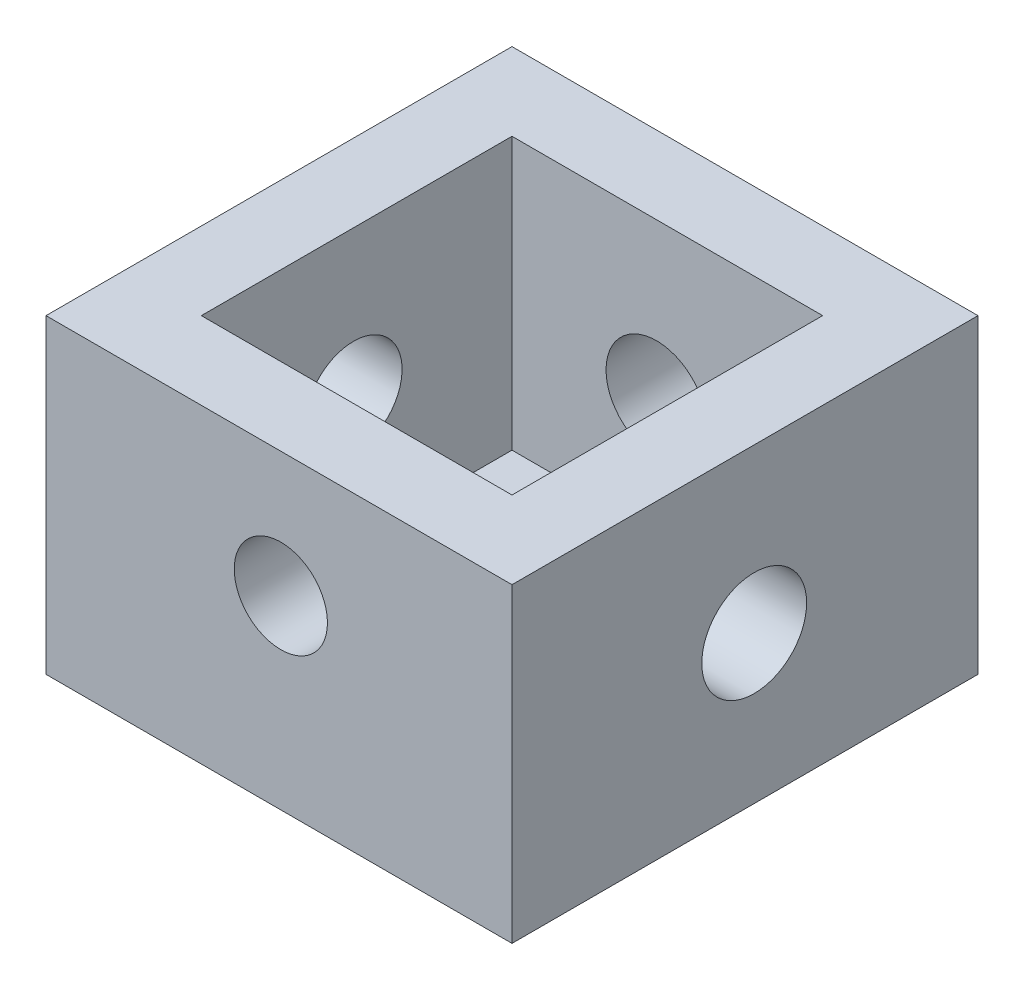
ISO-10303-21;
HEADER;
FILE_DESCRIPTION(('STEP AP214'),'2;1');
FILE_NAME('part.step','',(''),(''),'','','');
FILE_SCHEMA(('AUTOMOTIVE_DESIGN { 1 0 10303 214 1 1 1 1 }'));
ENDSEC;
DATA;
#1=APPLICATION_CONTEXT('core data for automotive mechanical design processes');
#2=APPLICATION_PROTOCOL_DEFINITION('international standard','automotive_design',2000,#1);
#3=PRODUCT_CONTEXT('',#1,'mechanical');
#4=PRODUCT('Part','Part','',(#3));
#5=PRODUCT_RELATED_PRODUCT_CATEGORY('part','',(#4));
#6=PRODUCT_DEFINITION_FORMATION('','',#4);
#7=PRODUCT_DEFINITION_CONTEXT('part definition',#1,'design');
#8=PRODUCT_DEFINITION('design','',#6,#7);
#9=PRODUCT_DEFINITION_SHAPE('','',#8);
#10=(LENGTH_UNIT() NAMED_UNIT(*) SI_UNIT(.MILLI.,.METRE.));
#11=(NAMED_UNIT(*) PLANE_ANGLE_UNIT() SI_UNIT($,.RADIAN.));
#12=(NAMED_UNIT(*) SI_UNIT($,.STERADIAN.) SOLID_ANGLE_UNIT());
#13=UNCERTAINTY_MEASURE_WITH_UNIT(LENGTH_MEASURE(1.E-05),#10,'distance_accuracy_value','');
#14=(GEOMETRIC_REPRESENTATION_CONTEXT(3) GLOBAL_UNCERTAINTY_ASSIGNED_CONTEXT((#13)) GLOBAL_UNIT_ASSIGNED_CONTEXT((#10,
#11,#12)) REPRESENTATION_CONTEXT('',''));
#15=CARTESIAN_POINT('',(0.,0.,0.));
#16=DIRECTION('',(0.,0.,1.));
#17=DIRECTION('',(1.,0.,0.));
#18=AXIS2_PLACEMENT_3D('',#15,#16,#17);
#19=CARTESIAN_POINT('',(-47.6315789473684,40.,-77.2368421052632));
#20=DIRECTION('',(1.,0.,0.));
#21=DIRECTION('',(0.,0.,-1.));
#22=AXIS2_PLACEMENT_3D('',#19,#20,#21);
#23=PLANE('',#22);
#24=DIRECTION('',(0.,0.,1.));
#25=VECTOR('',#24,1.);
#26=CARTESIAN_POINT('',(-47.6315789473684,0.,-77.2368421052632));
#27=LINE('',#26,#25);
#28=CARTESIAN_POINT('',(-47.6315789473684,0.,-77.2368421052632));
#29=VERTEX_POINT('',#28);
#30=CARTESIAN_POINT('',(-47.6315789473684,0.,-17.2368421052632));
#31=VERTEX_POINT('',#30);
#32=EDGE_CURVE('E160',#29,#31,#27,.T.);
#33=ORIENTED_EDGE('',*,*,#32,.T.);
#34=DIRECTION('',(0.,-1.,0.));
#35=VECTOR('',#34,1.);
#36=CARTESIAN_POINT('',(-47.6315789473684,40.,-17.2368421052632));
#37=LINE('',#36,#35);
#38=CARTESIAN_POINT('',(-47.6315789473684,40.,-17.2368421052632));
#39=VERTEX_POINT('',#38);
#40=EDGE_CURVE('E164',#39,#31,#37,.T.);
#41=ORIENTED_EDGE('',*,*,#40,.F.);
#42=DIRECTION('',(0.,0.,1.));
#43=VECTOR('',#42,1.);
#44=CARTESIAN_POINT('',(-47.6315789473684,40.,-77.2368421052632));
#45=LINE('',#44,#43);
#46=CARTESIAN_POINT('',(-47.6315789473684,40.,-77.2368421052632));
#47=VERTEX_POINT('',#46);
#48=EDGE_CURVE('E152',#47,#39,#45,.T.);
#49=ORIENTED_EDGE('',*,*,#48,.F.);
#50=DIRECTION('',(0.,-1.,0.));
#51=VECTOR('',#50,1.);
#52=CARTESIAN_POINT('',(-47.6315789473684,40.,-77.2368421052632));
#53=LINE('',#52,#51);
#54=EDGE_CURVE('E41',#47,#29,#53,.T.);
#55=ORIENTED_EDGE('',*,*,#54,.T.);
#56=EDGE_LOOP('',(#33,#41,#49,#55));
#57=FACE_BOUND('',#56,.T.);
#58=CARTESIAN_POINT('',(-47.6315789473684,21.0932716684626,-46.8351131772574));
#59=DIRECTION('',(-1.,0.,0.));
#60=DIRECTION('',(0.,0.,1.));
#61=AXIS2_PLACEMENT_3D('',#58,#59,#60);
#62=CIRCLE('',#61,6.25);
#63=CARTESIAN_POINT('',(-47.6315789473684,21.0932716684626,-40.5851131772574));
#64=VERTEX_POINT('',#63);
#65=EDGE_CURVE('E196',#64,#64,#62,.T.);
#66=ORIENTED_EDGE('',*,*,#65,.F.);
#67=EDGE_LOOP('',(#66));
#68=FACE_BOUND('',#67,.T.);
#69=ADVANCED_FACE('F33',(#57,#68),#23,.F.);
#70=CARTESIAN_POINT('',(-47.6315789473684,40.,-17.2368421052632));
#71=DIRECTION('',(0.,0.,-1.));
#72=DIRECTION('',(-1.,0.,0.));
#73=AXIS2_PLACEMENT_3D('',#70,#71,#72);
#74=PLANE('',#73);
#75=DIRECTION('',(1.,0.,0.));
#76=VECTOR('',#75,1.);
#77=CARTESIAN_POINT('',(-47.6315789473684,0.,-17.2368421052632));
#78=LINE('',#77,#76);
#79=CARTESIAN_POINT('',(12.3684210526316,0.,-17.2368421052632));
#80=VERTEX_POINT('',#79);
#81=EDGE_CURVE('E78',#31,#80,#78,.T.);
#82=ORIENTED_EDGE('',*,*,#81,.T.);
#83=DIRECTION('',(0.,-1.,0.));
#84=VECTOR('',#83,1.);
#85=CARTESIAN_POINT('',(12.3684210526316,40.,-17.2368421052632));
#86=LINE('',#85,#84);
#87=CARTESIAN_POINT('',(12.3684210526316,40.,-17.2368421052632));
#88=VERTEX_POINT('',#87);
#89=EDGE_CURVE('E155',#88,#80,#86,.T.);
#90=ORIENTED_EDGE('',*,*,#89,.F.);
#91=DIRECTION('',(1.,0.,0.));
#92=VECTOR('',#91,1.);
#93=CARTESIAN_POINT('',(-47.6315789473684,40.,-17.2368421052632));
#94=LINE('',#93,#92);
#95=EDGE_CURVE('E57',#39,#88,#94,.T.);
#96=ORIENTED_EDGE('',*,*,#95,.F.);
#97=ORIENTED_EDGE('',*,*,#40,.T.);
#98=EDGE_LOOP('',(#82,#90,#96,#97));
#99=FACE_BOUND('',#98,.T.);
#100=CARTESIAN_POINT('',(-17.3938566500453,23.8673899247033,-17.2368421052632));
#101=DIRECTION('',(0.,0.,1.));
#102=DIRECTION('',(1.,0.,0.));
#103=AXIS2_PLACEMENT_3D('',#100,#101,#102);
#104=CIRCLE('',#103,6.);
#105=CARTESIAN_POINT('',(-11.3938566500453,23.8673899247033,-17.2368421052632));
#106=VERTEX_POINT('',#105);
#107=EDGE_CURVE('E183',#106,#106,#104,.T.);
#108=ORIENTED_EDGE('',*,*,#107,.F.);
#109=EDGE_LOOP('',(#108));
#110=FACE_BOUND('',#109,.T.);
#111=ADVANCED_FACE('F177',(#99,#110),#74,.F.);
#112=CARTESIAN_POINT('',(12.3684210526316,40.,-77.2368421052632));
#113=DIRECTION('',(-1.,0.,0.));
#114=DIRECTION('',(0.,0.,1.));
#115=AXIS2_PLACEMENT_3D('',#112,#113,#114);
#116=PLANE('',#115);
#117=CARTESIAN_POINT('',(12.3684210526316,19.0144091342364,-48.4215666866429));
#118=DIRECTION('',(1.,0.,0.));
#119=DIRECTION('',(0.,0.,-1.));
#120=AXIS2_PLACEMENT_3D('',#117,#118,#119);
#121=CIRCLE('',#120,6.75);
#122=CARTESIAN_POINT('',(12.3684210526316,19.0144091342364,-55.1715666866429));
#123=VERTEX_POINT('',#122);
#124=EDGE_CURVE('E188',#123,#123,#121,.T.);
#125=ORIENTED_EDGE('',*,*,#124,.F.);
#126=EDGE_LOOP('',(#125));
#127=FACE_BOUND('',#126,.T.);
#128=DIRECTION('',(0.,0.,-1.));
#129=VECTOR('',#128,1.);
#130=CARTESIAN_POINT('',(12.3684210526316,0.,-77.2368421052632));
#131=LINE('',#130,#129);
#132=CARTESIAN_POINT('',(12.3684210526316,0.,-77.2368421052632));
#133=VERTEX_POINT('',#132);
#134=EDGE_CURVE('E145',#80,#133,#131,.T.);
#135=ORIENTED_EDGE('',*,*,#134,.T.);
#136=DIRECTION('',(0.,-1.,0.));
#137=VECTOR('',#136,1.);
#138=CARTESIAN_POINT('',(12.3684210526316,40.,-77.2368421052632));
#139=LINE('',#138,#137);
#140=CARTESIAN_POINT('',(12.3684210526316,40.,-77.2368421052632));
#141=VERTEX_POINT('',#140);
#142=EDGE_CURVE('E11',#141,#133,#139,.T.);
#143=ORIENTED_EDGE('',*,*,#142,.F.);
#144=DIRECTION('',(0.,0.,-1.));
#145=VECTOR('',#144,1.);
#146=CARTESIAN_POINT('',(12.3684210526316,40.,-77.2368421052632));
#147=LINE('',#146,#145);
#148=EDGE_CURVE('E149',#88,#141,#147,.T.);
#149=ORIENTED_EDGE('',*,*,#148,.F.);
#150=ORIENTED_EDGE('',*,*,#89,.T.);
#151=EDGE_LOOP('',(#135,#143,#149,#150));
#152=FACE_BOUND('',#151,.T.);
#153=ADVANCED_FACE('F35',(#127,#152),#116,.F.);
#154=CARTESIAN_POINT('',(-47.6315789473684,40.,-77.2368421052632));
#155=DIRECTION('',(0.,0.,1.));
#156=DIRECTION('',(1.,0.,0.));
#157=AXIS2_PLACEMENT_3D('',#154,#155,#156);
#158=PLANE('',#157);
#159=CARTESIAN_POINT('',(-19.022665383632,20.0118224268138,-77.2368421052632));
#160=DIRECTION('',(0.,0.,-1.));
#161=DIRECTION('',(-1.,0.,0.));
#162=AXIS2_PLACEMENT_3D('',#159,#160,#161);
#163=CIRCLE('',#162,6.5);
#164=CARTESIAN_POINT('',(-25.522665383632,20.0118224268138,-77.2368421052632));
#165=VERTEX_POINT('',#164);
#166=EDGE_CURVE('E202',#165,#165,#163,.T.);
#167=ORIENTED_EDGE('',*,*,#166,.F.);
#168=EDGE_LOOP('',(#167));
#169=FACE_BOUND('',#168,.T.);
#170=DIRECTION('',(-1.,0.,0.));
#171=VECTOR('',#170,1.);
#172=CARTESIAN_POINT('',(-47.6315789473684,0.,-77.2368421052632));
#173=LINE('',#172,#171);
#174=EDGE_CURVE('E158',#133,#29,#173,.T.);
#175=ORIENTED_EDGE('',*,*,#174,.T.);
#176=ORIENTED_EDGE('',*,*,#54,.F.);
#177=DIRECTION('',(-1.,0.,0.));
#178=VECTOR('',#177,1.);
#179=CARTESIAN_POINT('',(-47.6315789473684,40.,-77.2368421052632));
#180=LINE('',#179,#178);
#181=EDGE_CURVE('E85',#141,#47,#180,.T.);
#182=ORIENTED_EDGE('',*,*,#181,.F.);
#183=ORIENTED_EDGE('',*,*,#142,.T.);
#184=EDGE_LOOP('',(#175,#176,#182,#183));
#185=FACE_BOUND('',#184,.T.);
#186=ADVANCED_FACE('F208',(#169,#185),#158,.F.);
#187=CARTESIAN_POINT('',(0.,40.,0.));
#188=DIRECTION('',(0.,1.,0.));
#189=DIRECTION('',(0.,0.,1.));
#190=AXIS2_PLACEMENT_3D('',#187,#188,#189);
#191=PLANE('',#190);
#192=DIRECTION('',(0.,0.,-1.));
#193=VECTOR('',#192,1.);
#194=CARTESIAN_POINT('',(2.36842105263158,40.,-67.2368421052632));
#195=LINE('',#194,#193);
#196=CARTESIAN_POINT('',(2.36842105263158,40.,-27.2368421052632));
#197=VERTEX_POINT('',#196);
#198=CARTESIAN_POINT('',(2.36842105263158,40.,-67.2368421052632));
#199=VERTEX_POINT('',#198);
#200=EDGE_CURVE('E48',#197,#199,#195,.T.);
#201=ORIENTED_EDGE('',*,*,#200,.F.);
#202=DIRECTION('',(1.,0.,0.));
#203=VECTOR('',#202,1.);
#204=CARTESIAN_POINT('',(-37.6315789473684,40.,-27.2368421052632));
#205=LINE('',#204,#203);
#206=CARTESIAN_POINT('',(-37.6315789473684,40.,-27.2368421052632));
#207=VERTEX_POINT('',#206);
#208=EDGE_CURVE('E127',#207,#197,#205,.T.);
#209=ORIENTED_EDGE('',*,*,#208,.F.);
#210=DIRECTION('',(0.,0.,1.));
#211=VECTOR('',#210,1.);
#212=CARTESIAN_POINT('',(-37.6315789473684,40.,-67.2368421052632));
#213=LINE('',#212,#211);
#214=CARTESIAN_POINT('',(-37.6315789473684,40.,-67.2368421052632));
#215=VERTEX_POINT('',#214);
#216=EDGE_CURVE('E130',#215,#207,#213,.T.);
#217=ORIENTED_EDGE('',*,*,#216,.F.);
#218=DIRECTION('',(-1.,0.,0.));
#219=VECTOR('',#218,1.);
#220=CARTESIAN_POINT('',(-37.6315789473684,40.,-67.2368421052632));
#221=LINE('',#220,#219);
#222=EDGE_CURVE('E139',#199,#215,#221,.T.);
#223=ORIENTED_EDGE('',*,*,#222,.F.);
#224=EDGE_LOOP('',(#201,#209,#217,#223));
#225=FACE_BOUND('',#224,.T.);
#226=ORIENTED_EDGE('',*,*,#148,.T.);
#227=ORIENTED_EDGE('',*,*,#181,.T.);
#228=ORIENTED_EDGE('',*,*,#48,.T.);
#229=ORIENTED_EDGE('',*,*,#95,.T.);
#230=EDGE_LOOP('',(#226,#227,#228,#229));
#231=FACE_BOUND('',#230,.T.);
#232=ADVANCED_FACE('F210',(#225,#231),#191,.T.);
#233=CARTESIAN_POINT('',(0.,0.,0.));
#234=DIRECTION('',(0.,1.,0.));
#235=DIRECTION('',(0.,0.,1.));
#236=AXIS2_PLACEMENT_3D('',#233,#234,#235);
#237=PLANE('',#236);
#238=ORIENTED_EDGE('',*,*,#134,.F.);
#239=ORIENTED_EDGE('',*,*,#81,.F.);
#240=ORIENTED_EDGE('',*,*,#32,.F.);
#241=ORIENTED_EDGE('',*,*,#174,.F.);
#242=EDGE_LOOP('',(#238,#239,#240,#241));
#243=FACE_BOUND('',#242,.T.);
#244=ADVANCED_FACE('F173',(#243),#237,.F.);
#245=CARTESIAN_POINT('',(2.36842105263158,5.,-67.2368421052632));
#246=DIRECTION('',(1.,0.,0.));
#247=DIRECTION('',(0.,0.,-1.));
#248=AXIS2_PLACEMENT_3D('',#245,#246,#247);
#249=PLANE('',#248);
#250=CARTESIAN_POINT('',(2.36842105263158,19.0144091342364,-48.4215666866429));
#251=DIRECTION('',(1.,0.,0.));
#252=DIRECTION('',(0.,0.,-1.));
#253=AXIS2_PLACEMENT_3D('',#250,#251,#252);
#254=CIRCLE('',#253,6.75);
#255=CARTESIAN_POINT('',(2.36842105263158,19.0144091342364,-55.1715666866429));
#256=VERTEX_POINT('',#255);
#257=EDGE_CURVE('E185',#256,#256,#254,.T.);
#258=ORIENTED_EDGE('',*,*,#257,.T.);
#259=EDGE_LOOP('',(#258));
#260=FACE_BOUND('',#259,.T.);
#261=ORIENTED_EDGE('',*,*,#200,.T.);
#262=DIRECTION('',(0.,1.,0.));
#263=VECTOR('',#262,1.);
#264=CARTESIAN_POINT('',(2.36842105263158,5.,-67.2368421052632));
#265=LINE('',#264,#263);
#266=CARTESIAN_POINT('',(2.36842105263158,5.,-67.2368421052632));
#267=VERTEX_POINT('',#266);
#268=EDGE_CURVE('E105',#267,#199,#265,.T.);
#269=ORIENTED_EDGE('',*,*,#268,.F.);
#270=DIRECTION('',(0.,0.,-1.));
#271=VECTOR('',#270,1.);
#272=CARTESIAN_POINT('',(2.36842105263158,5.,-67.2368421052632));
#273=LINE('',#272,#271);
#274=CARTESIAN_POINT('',(2.36842105263158,5.,-27.2368421052632));
#275=VERTEX_POINT('',#274);
#276=EDGE_CURVE('E109',#275,#267,#273,.T.);
#277=ORIENTED_EDGE('',*,*,#276,.F.);
#278=DIRECTION('',(0.,1.,0.));
#279=VECTOR('',#278,1.);
#280=CARTESIAN_POINT('',(2.36842105263158,5.,-27.2368421052632));
#281=LINE('',#280,#279);
#282=EDGE_CURVE('E143',#275,#197,#281,.T.);
#283=ORIENTED_EDGE('',*,*,#282,.T.);
#284=EDGE_LOOP('',(#261,#269,#277,#283));
#285=FACE_BOUND('',#284,.T.);
#286=ADVANCED_FACE('F107',(#260,#285),#249,.F.);
#287=CARTESIAN_POINT('',(-37.6315789473684,5.,-27.2368421052632));
#288=DIRECTION('',(0.,0.,1.));
#289=DIRECTION('',(1.,0.,0.));
#290=AXIS2_PLACEMENT_3D('',#287,#288,#289);
#291=PLANE('',#290);
#292=CARTESIAN_POINT('',(-17.3938566500453,23.8673899247033,-27.2368421052632));
#293=DIRECTION('',(0.,0.,1.));
#294=DIRECTION('',(1.,0.,0.));
#295=AXIS2_PLACEMENT_3D('',#292,#293,#294);
#296=CIRCLE('',#295,6.);
#297=CARTESIAN_POINT('',(-11.3938566500453,23.8673899247033,-27.2368421052632));
#298=VERTEX_POINT('',#297);
#299=EDGE_CURVE('E133',#298,#298,#296,.T.);
#300=ORIENTED_EDGE('',*,*,#299,.T.);
#301=EDGE_LOOP('',(#300));
#302=FACE_BOUND('',#301,.T.);
#303=ORIENTED_EDGE('',*,*,#208,.T.);
#304=ORIENTED_EDGE('',*,*,#282,.F.);
#305=DIRECTION('',(1.,0.,0.));
#306=VECTOR('',#305,1.);
#307=CARTESIAN_POINT('',(-37.6315789473684,5.,-27.2368421052632));
#308=LINE('',#307,#306);
#309=CARTESIAN_POINT('',(-37.6315789473684,5.,-27.2368421052632));
#310=VERTEX_POINT('',#309);
#311=EDGE_CURVE('E115',#310,#275,#308,.T.);
#312=ORIENTED_EDGE('',*,*,#311,.F.);
#313=DIRECTION('',(0.,1.,0.));
#314=VECTOR('',#313,1.);
#315=CARTESIAN_POINT('',(-37.6315789473684,5.,-27.2368421052632));
#316=LINE('',#315,#314);
#317=EDGE_CURVE('E146',#310,#207,#316,.T.);
#318=ORIENTED_EDGE('',*,*,#317,.T.);
#319=EDGE_LOOP('',(#303,#304,#312,#318));
#320=FACE_BOUND('',#319,.T.);
#321=ADVANCED_FACE('F227',(#302,#320),#291,.F.);
#322=CARTESIAN_POINT('',(-37.6315789473684,5.,-67.2368421052632));
#323=DIRECTION('',(-1.,0.,0.));
#324=DIRECTION('',(0.,0.,1.));
#325=AXIS2_PLACEMENT_3D('',#322,#323,#324);
#326=PLANE('',#325);
#327=CARTESIAN_POINT('',(-37.6315789473684,21.0932716684626,-46.8351131772574));
#328=DIRECTION('',(-1.,0.,0.));
#329=DIRECTION('',(0.,0.,1.));
#330=AXIS2_PLACEMENT_3D('',#327,#328,#329);
#331=CIRCLE('',#330,6.25);
#332=CARTESIAN_POINT('',(-37.6315789473684,21.0932716684626,-40.5851131772574));
#333=VERTEX_POINT('',#332);
#334=EDGE_CURVE('E193',#333,#333,#331,.T.);
#335=ORIENTED_EDGE('',*,*,#334,.T.);
#336=EDGE_LOOP('',(#335));
#337=FACE_BOUND('',#336,.T.);
#338=ORIENTED_EDGE('',*,*,#216,.T.);
#339=ORIENTED_EDGE('',*,*,#317,.F.);
#340=DIRECTION('',(0.,0.,1.));
#341=VECTOR('',#340,1.);
#342=CARTESIAN_POINT('',(-37.6315789473684,5.,-67.2368421052632));
#343=LINE('',#342,#341);
#344=CARTESIAN_POINT('',(-37.6315789473684,5.,-67.2368421052632));
#345=VERTEX_POINT('',#344);
#346=EDGE_CURVE('E123',#345,#310,#343,.T.);
#347=ORIENTED_EDGE('',*,*,#346,.F.);
#348=DIRECTION('',(0.,1.,0.));
#349=VECTOR('',#348,1.);
#350=CARTESIAN_POINT('',(-37.6315789473684,5.,-67.2368421052632));
#351=LINE('',#350,#349);
#352=EDGE_CURVE('E114',#345,#215,#351,.T.);
#353=ORIENTED_EDGE('',*,*,#352,.T.);
#354=EDGE_LOOP('',(#338,#339,#347,#353));
#355=FACE_BOUND('',#354,.T.);
#356=ADVANCED_FACE('F231',(#337,#355),#326,.F.);
#357=CARTESIAN_POINT('',(-37.6315789473684,5.,-67.2368421052632));
#358=DIRECTION('',(0.,0.,-1.));
#359=DIRECTION('',(-1.,0.,0.));
#360=AXIS2_PLACEMENT_3D('',#357,#358,#359);
#361=PLANE('',#360);
#362=CARTESIAN_POINT('',(-19.022665383632,20.0118224268138,-67.2368421052632));
#363=DIRECTION('',(0.,0.,-1.));
#364=DIRECTION('',(-1.,0.,0.));
#365=AXIS2_PLACEMENT_3D('',#362,#363,#364);
#366=CIRCLE('',#365,6.5);
#367=CARTESIAN_POINT('',(-25.522665383632,20.0118224268138,-67.2368421052632));
#368=VERTEX_POINT('',#367);
#369=EDGE_CURVE('E199',#368,#368,#366,.T.);
#370=ORIENTED_EDGE('',*,*,#369,.T.);
#371=EDGE_LOOP('',(#370));
#372=FACE_BOUND('',#371,.T.);
#373=ORIENTED_EDGE('',*,*,#222,.T.);
#374=ORIENTED_EDGE('',*,*,#352,.F.);
#375=DIRECTION('',(-1.,0.,0.));
#376=VECTOR('',#375,1.);
#377=CARTESIAN_POINT('',(-37.6315789473684,5.,-67.2368421052632));
#378=LINE('',#377,#376);
#379=EDGE_CURVE('E118',#267,#345,#378,.T.);
#380=ORIENTED_EDGE('',*,*,#379,.F.);
#381=ORIENTED_EDGE('',*,*,#268,.T.);
#382=EDGE_LOOP('',(#373,#374,#380,#381));
#383=FACE_BOUND('',#382,.T.);
#384=ADVANCED_FACE('F119',(#372,#383),#361,.F.);
#385=CARTESIAN_POINT('',(0.,5.,0.));
#386=DIRECTION('',(0.,1.,0.));
#387=DIRECTION('',(0.,0.,1.));
#388=AXIS2_PLACEMENT_3D('',#385,#386,#387);
#389=PLANE('',#388);
#390=ORIENTED_EDGE('',*,*,#276,.T.);
#391=ORIENTED_EDGE('',*,*,#379,.T.);
#392=ORIENTED_EDGE('',*,*,#346,.T.);
#393=ORIENTED_EDGE('',*,*,#311,.T.);
#394=EDGE_LOOP('',(#390,#391,#392,#393));
#395=FACE_BOUND('',#394,.T.);
#396=ADVANCED_FACE('F125',(#395),#389,.T.);
#397=CARTESIAN_POINT('',(-17.3938566500453,23.8673899247033,-17.2368421052632));
#398=DIRECTION('',(0.,0.,1.));
#399=DIRECTION('',(1.,0.,0.));
#400=AXIS2_PLACEMENT_3D('',#397,#398,#399);
#401=CYLINDRICAL_SURFACE('',#400,6.);
#402=ORIENTED_EDGE('',*,*,#299,.F.);
#403=EDGE_LOOP('',(#402));
#404=FACE_BOUND('',#403,.T.);
#405=ORIENTED_EDGE('',*,*,#107,.T.);
#406=EDGE_LOOP('',(#405));
#407=FACE_BOUND('',#406,.T.);
#408=ADVANCED_FACE('F241',(#404,#407),#401,.F.);
#409=CARTESIAN_POINT('',(12.3684210526316,19.0144091342364,-48.4215666866429));
#410=DIRECTION('',(1.,0.,0.));
#411=DIRECTION('',(0.,0.,-1.));
#412=AXIS2_PLACEMENT_3D('',#409,#410,#411);
#413=CYLINDRICAL_SURFACE('',#412,6.75);
#414=ORIENTED_EDGE('',*,*,#257,.F.);
#415=EDGE_LOOP('',(#414));
#416=FACE_BOUND('',#415,.T.);
#417=ORIENTED_EDGE('',*,*,#124,.T.);
#418=EDGE_LOOP('',(#417));
#419=FACE_BOUND('',#418,.T.);
#420=ADVANCED_FACE('F244',(#416,#419),#413,.F.);
#421=CARTESIAN_POINT('',(-47.6315789473684,21.0932716684626,-46.8351131772574));
#422=DIRECTION('',(-1.,0.,0.));
#423=DIRECTION('',(0.,0.,1.));
#424=AXIS2_PLACEMENT_3D('',#421,#422,#423);
#425=CYLINDRICAL_SURFACE('',#424,6.25);
#426=ORIENTED_EDGE('',*,*,#334,.F.);
#427=EDGE_LOOP('',(#426));
#428=FACE_BOUND('',#427,.T.);
#429=ORIENTED_EDGE('',*,*,#65,.T.);
#430=EDGE_LOOP('',(#429));
#431=FACE_BOUND('',#430,.T.);
#432=ADVANCED_FACE('F248',(#428,#431),#425,.F.);
#433=CARTESIAN_POINT('',(-19.022665383632,20.0118224268138,-77.2368421052632));
#434=DIRECTION('',(0.,0.,-1.));
#435=DIRECTION('',(-1.,0.,0.));
#436=AXIS2_PLACEMENT_3D('',#433,#434,#435);
#437=CYLINDRICAL_SURFACE('',#436,6.5);
#438=ORIENTED_EDGE('',*,*,#369,.F.);
#439=EDGE_LOOP('',(#438));
#440=FACE_BOUND('',#439,.T.);
#441=ORIENTED_EDGE('',*,*,#166,.T.);
#442=EDGE_LOOP('',(#441));
#443=FACE_BOUND('',#442,.T.);
#444=ADVANCED_FACE('F206',(#440,#443),#437,.F.);
#445=CLOSED_SHELL('',(#69,#111,#153,#186,#232,#244,#286,#321,#356,#384,#396,#408,#420,#432,#444));
#446=MANIFOLD_SOLID_BREP('B2',#445);
#447=ADVANCED_BREP_SHAPE_REPRESENTATION('',(#18,#446),#14);
#448=SHAPE_DEFINITION_REPRESENTATION(#9,#447);
ENDSEC;
END-ISO-10303-21;
